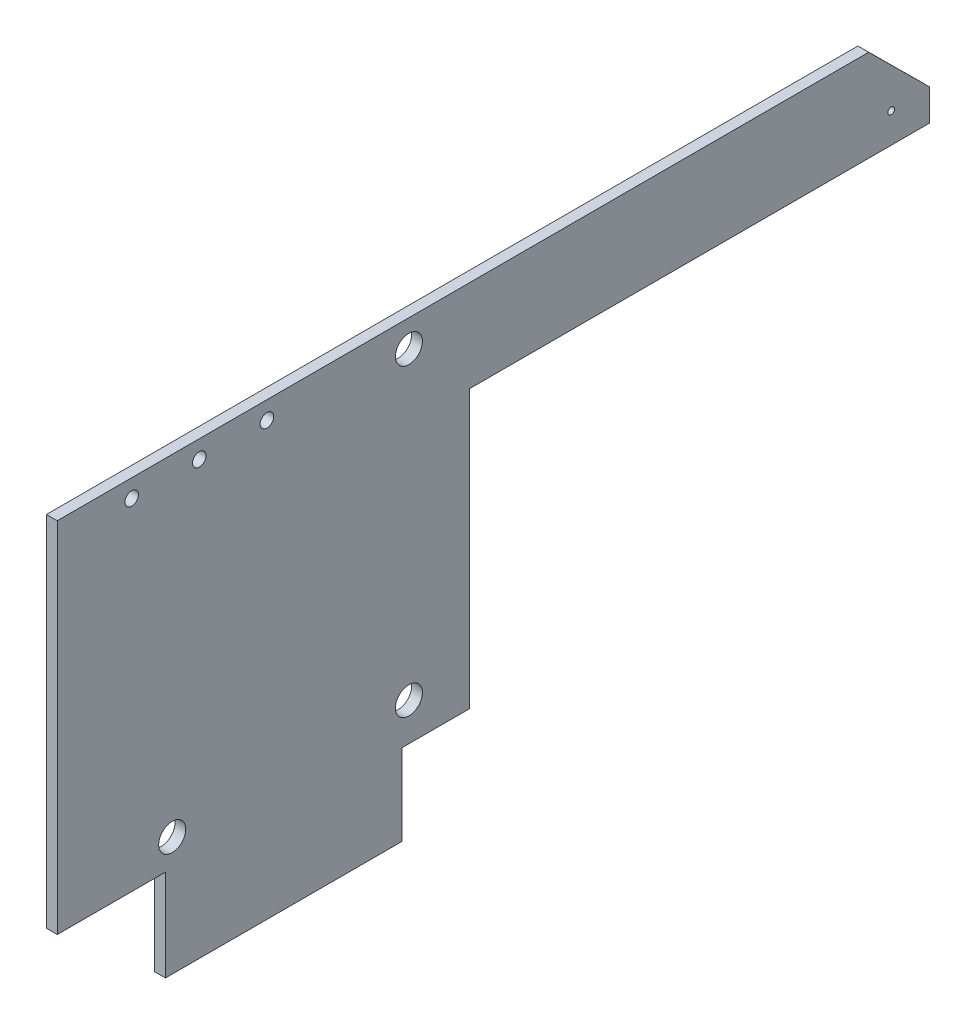
ISO-10303-21;
HEADER;
FILE_DESCRIPTION(('STEP AP214'),'2;1');
FILE_NAME('part.step','',(''),(''),'','','');
FILE_SCHEMA(('AUTOMOTIVE_DESIGN { 1 0 10303 214 1 1 1 1 }'));
ENDSEC;
DATA;
#1=APPLICATION_CONTEXT('core data for automotive mechanical design processes');
#2=APPLICATION_PROTOCOL_DEFINITION('international standard','automotive_design',2000,#1);
#3=PRODUCT_CONTEXT('',#1,'mechanical');
#4=PRODUCT('Part','Part','',(#3));
#5=PRODUCT_RELATED_PRODUCT_CATEGORY('part','',(#4));
#6=PRODUCT_DEFINITION_FORMATION('','',#4);
#7=PRODUCT_DEFINITION_CONTEXT('part definition',#1,'design');
#8=PRODUCT_DEFINITION('design','',#6,#7);
#9=PRODUCT_DEFINITION_SHAPE('','',#8);
#10=(LENGTH_UNIT() NAMED_UNIT(*) SI_UNIT(.MILLI.,.METRE.));
#11=(NAMED_UNIT(*) PLANE_ANGLE_UNIT() SI_UNIT($,.RADIAN.));
#12=(NAMED_UNIT(*) SI_UNIT($,.STERADIAN.) SOLID_ANGLE_UNIT());
#13=UNCERTAINTY_MEASURE_WITH_UNIT(LENGTH_MEASURE(1.E-05),#10,'distance_accuracy_value','');
#14=(GEOMETRIC_REPRESENTATION_CONTEXT(3) GLOBAL_UNCERTAINTY_ASSIGNED_CONTEXT((#13)) GLOBAL_UNIT_ASSIGNED_CONTEXT((#10,
#11,#12)) REPRESENTATION_CONTEXT('',''));
#15=CARTESIAN_POINT('',(0.,0.,0.));
#16=DIRECTION('',(0.,0.,1.));
#17=DIRECTION('',(1.,0.,0.));
#18=AXIS2_PLACEMENT_3D('',#15,#16,#17);
#19=CARTESIAN_POINT('',(1.6,0.,0.));
#20=DIRECTION('',(-1.,0.,0.));
#21=DIRECTION('',(0.,0.,1.));
#22=AXIS2_PLACEMENT_3D('',#19,#20,#21);
#23=PLANE('',#22);
#24=DIRECTION('',(0.,0.,-1.));
#25=VECTOR('',#24,1.);
#26=CARTESIAN_POINT('',(1.6,11.,-19.));
#27=LINE('',#26,#25);
#28=CARTESIAN_POINT('',(1.6,11.,-3.));
#29=VERTEX_POINT('',#28);
#30=CARTESIAN_POINT('',(1.6,11.,-19.));
#31=VERTEX_POINT('',#30);
#32=EDGE_CURVE('E169',#29,#31,#27,.T.);
#33=ORIENTED_EDGE('',*,*,#32,.T.);
#34=DIRECTION('',(0.,-1.,0.));
#35=VECTOR('',#34,1.);
#36=CARTESIAN_POINT('',(1.6,-2.56392602125544,-19.));
#37=LINE('',#36,#35);
#38=CARTESIAN_POINT('',(1.6,-2.56392602125544,-19.));
#39=VERTEX_POINT('',#38);
#40=EDGE_CURVE('E102',#31,#39,#37,.T.);
#41=ORIENTED_EDGE('',*,*,#40,.T.);
#42=DIRECTION('',(0.,0.,-1.));
#43=VECTOR('',#42,1.);
#44=CARTESIAN_POINT('',(1.6,-2.56392602125544,-54.));
#45=LINE('',#44,#43);
#46=CARTESIAN_POINT('',(1.6,-2.56392602125544,-54.));
#47=VERTEX_POINT('',#46);
#48=EDGE_CURVE('E193',#39,#47,#45,.T.);
#49=ORIENTED_EDGE('',*,*,#48,.T.);
#50=DIRECTION('',(0.,1.,0.));
#51=VECTOR('',#50,1.);
#52=CARTESIAN_POINT('',(1.6,9.43607397874456,-54.));
#53=LINE('',#52,#51);
#54=CARTESIAN_POINT('',(1.6,9.43607397874456,-54.));
#55=VERTEX_POINT('',#54);
#56=EDGE_CURVE('E212',#47,#55,#53,.T.);
#57=ORIENTED_EDGE('',*,*,#56,.T.);
#58=DIRECTION('',(0.,0.,-1.));
#59=VECTOR('',#58,1.);
#60=CARTESIAN_POINT('',(1.6,9.43607397874456,-64.));
#61=LINE('',#60,#59);
#62=CARTESIAN_POINT('',(1.6,9.43607397874456,-64.));
#63=VERTEX_POINT('',#62);
#64=EDGE_CURVE('E209',#55,#63,#61,.T.);
#65=ORIENTED_EDGE('',*,*,#64,.T.);
#66=DIRECTION('',(0.,1.,0.));
#67=VECTOR('',#66,1.);
#68=CARTESIAN_POINT('',(1.6,50.4234303047777,-64.));
#69=LINE('',#68,#67);
#70=CARTESIAN_POINT('',(1.6,50.4234303047777,-64.));
#71=VERTEX_POINT('',#70);
#72=EDGE_CURVE('E211',#63,#71,#69,.T.);
#73=ORIENTED_EDGE('',*,*,#72,.T.);
#74=DIRECTION('',(0.,0.,-1.));
#75=VECTOR('',#74,1.);
#76=CARTESIAN_POINT('',(1.6,50.4234303047777,-132.));
#77=LINE('',#76,#75);
#78=CARTESIAN_POINT('',(1.6,50.4234303047777,-132.));
#79=VERTEX_POINT('',#78);
#80=EDGE_CURVE('E214',#71,#79,#77,.T.);
#81=ORIENTED_EDGE('',*,*,#80,.T.);
#82=DIRECTION('',(0.,1.,0.));
#83=VECTOR('',#82,1.);
#84=CARTESIAN_POINT('',(1.6,55.0634303047775,-132.));
#85=LINE('',#84,#83);
#86=CARTESIAN_POINT('',(1.6,55.0634303047775,-132.));
#87=VERTEX_POINT('',#86);
#88=EDGE_CURVE('E130',#79,#87,#85,.T.);
#89=ORIENTED_EDGE('',*,*,#88,.T.);
#90=DIRECTION('',(0.,0.70460178581762,0.709602933634452));
#91=VECTOR('',#90,1.);
#92=CARTESIAN_POINT('',(1.6,64.,-123.));
#93=LINE('',#92,#91);
#94=CARTESIAN_POINT('',(1.6,64.,-123.));
#95=VERTEX_POINT('',#94);
#96=EDGE_CURVE('E124',#87,#95,#93,.T.);
#97=ORIENTED_EDGE('',*,*,#96,.T.);
#98=DIRECTION('',(0.,0.,1.));
#99=VECTOR('',#98,1.);
#100=CARTESIAN_POINT('',(1.6,64.,-3.));
#101=LINE('',#100,#99);
#102=CARTESIAN_POINT('',(1.6,64.,-3.));
#103=VERTEX_POINT('',#102);
#104=EDGE_CURVE('E128',#95,#103,#101,.T.);
#105=ORIENTED_EDGE('',*,*,#104,.T.);
#106=DIRECTION('',(0.,-1.,0.));
#107=VECTOR('',#106,1.);
#108=CARTESIAN_POINT('',(1.6,11.,-3.));
#109=LINE('',#108,#107);
#110=EDGE_CURVE('E50',#103,#29,#109,.T.);
#111=ORIENTED_EDGE('',*,*,#110,.T.);
#112=EDGE_LOOP('',(#33,#41,#49,#57,#65,#73,#81,#89,#97,#105,#111));
#113=FACE_BOUND('',#112,.T.);
#114=CARTESIAN_POINT('',(1.6,15.,-20.));
#115=DIRECTION('',(1.,0.,0.));
#116=DIRECTION('',(0.,0.,-1.));
#117=AXIS2_PLACEMENT_3D('',#114,#115,#116);
#118=CIRCLE('',#117,2.);
#119=CARTESIAN_POINT('',(1.6,15.,-22.));
#120=VERTEX_POINT('',#119);
#121=EDGE_CURVE('E152',#120,#120,#118,.T.);
#122=ORIENTED_EDGE('',*,*,#121,.F.);
#123=EDGE_LOOP('',(#122));
#124=FACE_BOUND('',#123,.T.);
#125=CARTESIAN_POINT('',(1.6,15.,-55.));
#126=DIRECTION('',(1.,0.,0.));
#127=DIRECTION('',(0.,0.,-1.));
#128=AXIS2_PLACEMENT_3D('',#125,#126,#127);
#129=CIRCLE('',#128,2.);
#130=CARTESIAN_POINT('',(1.6,15.,-57.));
#131=VERTEX_POINT('',#130);
#132=EDGE_CURVE('E311',#131,#131,#129,.T.);
#133=ORIENTED_EDGE('',*,*,#132,.F.);
#134=EDGE_LOOP('',(#133));
#135=FACE_BOUND('',#134,.T.);
#136=CARTESIAN_POINT('',(1.6,60.,-55.));
#137=DIRECTION('',(1.,0.,0.));
#138=DIRECTION('',(0.,0.,-1.));
#139=AXIS2_PLACEMENT_3D('',#136,#137,#138);
#140=CIRCLE('',#139,2.);
#141=CARTESIAN_POINT('',(1.6,60.,-57.));
#142=VERTEX_POINT('',#141);
#143=EDGE_CURVE('E305',#142,#142,#140,.T.);
#144=ORIENTED_EDGE('',*,*,#143,.F.);
#145=EDGE_LOOP('',(#144));
#146=FACE_BOUND('',#145,.T.);
#147=CARTESIAN_POINT('',(1.6,61.35,-24.));
#148=DIRECTION('',(1.,0.,0.));
#149=DIRECTION('',(0.,0.,-1.));
#150=AXIS2_PLACEMENT_3D('',#147,#148,#149);
#151=CIRCLE('',#150,1.00000000000001);
#152=CARTESIAN_POINT('',(1.6,61.35,-25.));
#153=VERTEX_POINT('',#152);
#154=EDGE_CURVE('E299',#153,#153,#151,.T.);
#155=ORIENTED_EDGE('',*,*,#154,.F.);
#156=EDGE_LOOP('',(#155));
#157=FACE_BOUND('',#156,.T.);
#158=CARTESIAN_POINT('',(1.6,61.35,-34.));
#159=DIRECTION('',(1.,0.,0.));
#160=DIRECTION('',(0.,0.,-1.));
#161=AXIS2_PLACEMENT_3D('',#158,#159,#160);
#162=CIRCLE('',#161,0.999999999999998);
#163=CARTESIAN_POINT('',(1.6,61.35,-35.));
#164=VERTEX_POINT('',#163);
#165=EDGE_CURVE('E293',#164,#164,#162,.T.);
#166=ORIENTED_EDGE('',*,*,#165,.F.);
#167=EDGE_LOOP('',(#166));
#168=FACE_BOUND('',#167,.T.);
#169=CARTESIAN_POINT('',(1.6,61.35,-14.));
#170=DIRECTION('',(1.,0.,0.));
#171=DIRECTION('',(0.,0.,-1.));
#172=AXIS2_PLACEMENT_3D('',#169,#170,#171);
#173=CIRCLE('',#172,1.00000000000001);
#174=CARTESIAN_POINT('',(1.6,61.35,-15.));
#175=VERTEX_POINT('',#174);
#176=EDGE_CURVE('E287',#175,#175,#173,.T.);
#177=ORIENTED_EDGE('',*,*,#176,.F.);
#178=EDGE_LOOP('',(#177));
#179=FACE_BOUND('',#178,.T.);
#180=CARTESIAN_POINT('',(1.6,54.8322024098017,-126.328248557873));
#181=DIRECTION('',(1.,0.,0.));
#182=DIRECTION('',(0.,0.,-1.));
#183=AXIS2_PLACEMENT_3D('',#180,#181,#182);
#184=CIRCLE('',#183,0.499999999999999);
#185=CARTESIAN_POINT('',(1.6,54.8322024098017,-126.828248557873));
#186=VERTEX_POINT('',#185);
#187=EDGE_CURVE('E278',#186,#186,#184,.T.);
#188=ORIENTED_EDGE('',*,*,#187,.F.);
#189=EDGE_LOOP('',(#188));
#190=FACE_BOUND('',#189,.T.);
#191=ADVANCED_FACE('F33',(#113,#124,#135,#146,#157,#168,#179,#190),#23,.F.);
#192=CARTESIAN_POINT('',(0.,0.,0.));
#193=DIRECTION('',(-1.,0.,0.));
#194=DIRECTION('',(0.,0.,1.));
#195=AXIS2_PLACEMENT_3D('',#192,#193,#194);
#196=PLANE('',#195);
#197=CARTESIAN_POINT('',(0.,61.35,-14.));
#198=DIRECTION('',(1.,0.,0.));
#199=DIRECTION('',(0.,0.,-1.));
#200=AXIS2_PLACEMENT_3D('',#197,#198,#199);
#201=CIRCLE('',#200,1.00000000000001);
#202=CARTESIAN_POINT('',(0.,61.35,-15.));
#203=VERTEX_POINT('',#202);
#204=EDGE_CURVE('E284',#203,#203,#201,.T.);
#205=ORIENTED_EDGE('',*,*,#204,.T.);
#206=EDGE_LOOP('',(#205));
#207=FACE_BOUND('',#206,.T.);
#208=CARTESIAN_POINT('',(0.,61.35,-24.));
#209=DIRECTION('',(1.,0.,0.));
#210=DIRECTION('',(0.,0.,-1.));
#211=AXIS2_PLACEMENT_3D('',#208,#209,#210);
#212=CIRCLE('',#211,1.00000000000001);
#213=CARTESIAN_POINT('',(0.,61.35,-25.));
#214=VERTEX_POINT('',#213);
#215=EDGE_CURVE('E296',#214,#214,#212,.T.);
#216=ORIENTED_EDGE('',*,*,#215,.T.);
#217=EDGE_LOOP('',(#216));
#218=FACE_BOUND('',#217,.T.);
#219=CARTESIAN_POINT('',(0.,15.,-55.));
#220=DIRECTION('',(1.,0.,0.));
#221=DIRECTION('',(0.,0.,-1.));
#222=AXIS2_PLACEMENT_3D('',#219,#220,#221);
#223=CIRCLE('',#222,2.);
#224=CARTESIAN_POINT('',(0.,15.,-57.));
#225=VERTEX_POINT('',#224);
#226=EDGE_CURVE('E308',#225,#225,#223,.T.);
#227=ORIENTED_EDGE('',*,*,#226,.T.);
#228=EDGE_LOOP('',(#227));
#229=FACE_BOUND('',#228,.T.);
#230=DIRECTION('',(0.,0.,-1.));
#231=VECTOR('',#230,1.);
#232=CARTESIAN_POINT('',(0.,11.,-19.));
#233=LINE('',#232,#231);
#234=CARTESIAN_POINT('',(0.,11.,-3.));
#235=VERTEX_POINT('',#234);
#236=CARTESIAN_POINT('',(0.,11.,-19.));
#237=VERTEX_POINT('',#236);
#238=EDGE_CURVE('E148',#235,#237,#233,.T.);
#239=ORIENTED_EDGE('',*,*,#238,.F.);
#240=DIRECTION('',(0.,-1.,0.));
#241=VECTOR('',#240,1.);
#242=CARTESIAN_POINT('',(0.,11.,-3.));
#243=LINE('',#242,#241);
#244=CARTESIAN_POINT('',(0.,64.,-3.));
#245=VERTEX_POINT('',#244);
#246=EDGE_CURVE('E94',#245,#235,#243,.T.);
#247=ORIENTED_EDGE('',*,*,#246,.F.);
#248=DIRECTION('',(0.,0.,1.));
#249=VECTOR('',#248,1.);
#250=CARTESIAN_POINT('',(0.,64.,-3.));
#251=LINE('',#250,#249);
#252=CARTESIAN_POINT('',(0.,64.,-123.));
#253=VERTEX_POINT('',#252);
#254=EDGE_CURVE('E88',#253,#245,#251,.T.);
#255=ORIENTED_EDGE('',*,*,#254,.F.);
#256=DIRECTION('',(0.,0.70460178581762,0.709602933634452));
#257=VECTOR('',#256,1.);
#258=CARTESIAN_POINT('',(0.,64.,-123.));
#259=LINE('',#258,#257);
#260=CARTESIAN_POINT('',(0.,55.0634303047775,-132.));
#261=VERTEX_POINT('',#260);
#262=EDGE_CURVE('E138',#261,#253,#259,.T.);
#263=ORIENTED_EDGE('',*,*,#262,.F.);
#264=DIRECTION('',(0.,1.,0.));
#265=VECTOR('',#264,1.);
#266=CARTESIAN_POINT('',(0.,55.0634303047775,-132.));
#267=LINE('',#266,#265);
#268=CARTESIAN_POINT('',(0.,50.4234303047777,-132.));
#269=VERTEX_POINT('',#268);
#270=EDGE_CURVE('E164',#269,#261,#267,.T.);
#271=ORIENTED_EDGE('',*,*,#270,.F.);
#272=DIRECTION('',(0.,0.,-1.));
#273=VECTOR('',#272,1.);
#274=CARTESIAN_POINT('',(0.,50.4234303047777,-132.));
#275=LINE('',#274,#273);
#276=CARTESIAN_POINT('',(0.,50.4234303047777,-64.));
#277=VERTEX_POINT('',#276);
#278=EDGE_CURVE('E162',#277,#269,#275,.T.);
#279=ORIENTED_EDGE('',*,*,#278,.F.);
#280=DIRECTION('',(0.,1.,0.));
#281=VECTOR('',#280,1.);
#282=CARTESIAN_POINT('',(0.,50.4234303047777,-64.));
#283=LINE('',#282,#281);
#284=CARTESIAN_POINT('',(0.,9.43607397874456,-64.));
#285=VERTEX_POINT('',#284);
#286=EDGE_CURVE('E160',#285,#277,#283,.T.);
#287=ORIENTED_EDGE('',*,*,#286,.F.);
#288=DIRECTION('',(0.,0.,-1.));
#289=VECTOR('',#288,1.);
#290=CARTESIAN_POINT('',(0.,9.43607397874456,-64.));
#291=LINE('',#290,#289);
#292=CARTESIAN_POINT('',(0.,9.43607397874456,-54.));
#293=VERTEX_POINT('',#292);
#294=EDGE_CURVE('E158',#293,#285,#291,.T.);
#295=ORIENTED_EDGE('',*,*,#294,.F.);
#296=DIRECTION('',(0.,1.,0.));
#297=VECTOR('',#296,1.);
#298=CARTESIAN_POINT('',(0.,9.43607397874456,-54.));
#299=LINE('',#298,#297);
#300=CARTESIAN_POINT('',(0.,-2.56392602125544,-54.));
#301=VERTEX_POINT('',#300);
#302=EDGE_CURVE('E156',#301,#293,#299,.T.);
#303=ORIENTED_EDGE('',*,*,#302,.F.);
#304=DIRECTION('',(0.,0.,-1.));
#305=VECTOR('',#304,1.);
#306=CARTESIAN_POINT('',(0.,-2.56392602125544,-54.));
#307=LINE('',#306,#305);
#308=CARTESIAN_POINT('',(0.,-2.56392602125544,-19.));
#309=VERTEX_POINT('',#308);
#310=EDGE_CURVE('E154',#309,#301,#307,.T.);
#311=ORIENTED_EDGE('',*,*,#310,.F.);
#312=DIRECTION('',(0.,-1.,0.));
#313=VECTOR('',#312,1.);
#314=CARTESIAN_POINT('',(0.,-2.56392602125544,-19.));
#315=LINE('',#314,#313);
#316=EDGE_CURVE('E151',#237,#309,#315,.T.);
#317=ORIENTED_EDGE('',*,*,#316,.F.);
#318=EDGE_LOOP('',(#239,#247,#255,#263,#271,#279,#287,#295,#303,#311,#317));
#319=FACE_BOUND('',#318,.T.);
#320=CARTESIAN_POINT('',(0.,15.,-20.));
#321=DIRECTION('',(1.,0.,0.));
#322=DIRECTION('',(0.,0.,-1.));
#323=AXIS2_PLACEMENT_3D('',#320,#321,#322);
#324=CIRCLE('',#323,2.);
#325=CARTESIAN_POINT('',(0.,15.,-22.));
#326=VERTEX_POINT('',#325);
#327=EDGE_CURVE('E314',#326,#326,#324,.T.);
#328=ORIENTED_EDGE('',*,*,#327,.T.);
#329=EDGE_LOOP('',(#328));
#330=FACE_BOUND('',#329,.T.);
#331=CARTESIAN_POINT('',(0.,60.,-55.));
#332=DIRECTION('',(1.,0.,0.));
#333=DIRECTION('',(0.,0.,-1.));
#334=AXIS2_PLACEMENT_3D('',#331,#332,#333);
#335=CIRCLE('',#334,2.);
#336=CARTESIAN_POINT('',(0.,60.,-57.));
#337=VERTEX_POINT('',#336);
#338=EDGE_CURVE('E302',#337,#337,#335,.T.);
#339=ORIENTED_EDGE('',*,*,#338,.T.);
#340=EDGE_LOOP('',(#339));
#341=FACE_BOUND('',#340,.T.);
#342=CARTESIAN_POINT('',(0.,61.35,-34.));
#343=DIRECTION('',(1.,0.,0.));
#344=DIRECTION('',(0.,0.,-1.));
#345=AXIS2_PLACEMENT_3D('',#342,#343,#344);
#346=CIRCLE('',#345,0.999999999999998);
#347=CARTESIAN_POINT('',(0.,61.35,-35.));
#348=VERTEX_POINT('',#347);
#349=EDGE_CURVE('E290',#348,#348,#346,.T.);
#350=ORIENTED_EDGE('',*,*,#349,.T.);
#351=EDGE_LOOP('',(#350));
#352=FACE_BOUND('',#351,.T.);
#353=CARTESIAN_POINT('',(0.,54.8322024098017,-126.328248557873));
#354=DIRECTION('',(1.,0.,0.));
#355=DIRECTION('',(0.,0.,-1.));
#356=AXIS2_PLACEMENT_3D('',#353,#354,#355);
#357=CIRCLE('',#356,0.499999999999999);
#358=CARTESIAN_POINT('',(0.,54.8322024098017,-126.828248557873));
#359=VERTEX_POINT('',#358);
#360=EDGE_CURVE('E281',#359,#359,#357,.T.);
#361=ORIENTED_EDGE('',*,*,#360,.T.);
#362=EDGE_LOOP('',(#361));
#363=FACE_BOUND('',#362,.T.);
#364=ADVANCED_FACE('F197',(#207,#218,#229,#319,#330,#341,#352,#363),#196,.T.);
#365=CARTESIAN_POINT('',(1.6,11.,-19.));
#366=DIRECTION('',(0.,1.,0.));
#367=DIRECTION('',(0.,0.,1.));
#368=AXIS2_PLACEMENT_3D('',#365,#366,#367);
#369=PLANE('',#368);
#370=ORIENTED_EDGE('',*,*,#238,.T.);
#371=DIRECTION('',(-1.,0.,0.));
#372=VECTOR('',#371,1.);
#373=CARTESIAN_POINT('',(1.6,11.,-19.));
#374=LINE('',#373,#372);
#375=EDGE_CURVE('E11',#31,#237,#374,.T.);
#376=ORIENTED_EDGE('',*,*,#375,.F.);
#377=ORIENTED_EDGE('',*,*,#32,.F.);
#378=DIRECTION('',(-1.,0.,0.));
#379=VECTOR('',#378,1.);
#380=CARTESIAN_POINT('',(1.6,11.,-3.));
#381=LINE('',#380,#379);
#382=EDGE_CURVE('E144',#29,#235,#381,.T.);
#383=ORIENTED_EDGE('',*,*,#382,.T.);
#384=EDGE_LOOP('',(#370,#376,#377,#383));
#385=FACE_BOUND('',#384,.T.);
#386=ADVANCED_FACE('F35',(#385),#369,.F.);
#387=CARTESIAN_POINT('',(1.6,-2.56392602125544,-19.));
#388=DIRECTION('',(0.,0.,-1.));
#389=DIRECTION('',(-1.,0.,0.));
#390=AXIS2_PLACEMENT_3D('',#387,#388,#389);
#391=PLANE('',#390);
#392=ORIENTED_EDGE('',*,*,#316,.T.);
#393=DIRECTION('',(-1.,0.,0.));
#394=VECTOR('',#393,1.);
#395=CARTESIAN_POINT('',(1.6,-2.56392602125544,-19.));
#396=LINE('',#395,#394);
#397=EDGE_CURVE('E42',#39,#309,#396,.T.);
#398=ORIENTED_EDGE('',*,*,#397,.F.);
#399=ORIENTED_EDGE('',*,*,#40,.F.);
#400=ORIENTED_EDGE('',*,*,#375,.T.);
#401=EDGE_LOOP('',(#392,#398,#399,#400));
#402=FACE_BOUND('',#401,.T.);
#403=ADVANCED_FACE('F443',(#402),#391,.F.);
#404=CARTESIAN_POINT('',(1.6,-2.56392602125544,-54.));
#405=DIRECTION('',(0.,1.,0.));
#406=DIRECTION('',(0.,0.,1.));
#407=AXIS2_PLACEMENT_3D('',#404,#405,#406);
#408=PLANE('',#407);
#409=ORIENTED_EDGE('',*,*,#310,.T.);
#410=DIRECTION('',(-1.,0.,0.));
#411=VECTOR('',#410,1.);
#412=CARTESIAN_POINT('',(1.6,-2.56392602125544,-54.));
#413=LINE('',#412,#411);
#414=EDGE_CURVE('E185',#47,#301,#413,.T.);
#415=ORIENTED_EDGE('',*,*,#414,.F.);
#416=ORIENTED_EDGE('',*,*,#48,.F.);
#417=ORIENTED_EDGE('',*,*,#397,.T.);
#418=EDGE_LOOP('',(#409,#415,#416,#417));
#419=FACE_BOUND('',#418,.T.);
#420=ADVANCED_FACE('F191',(#419),#408,.F.);
#421=CARTESIAN_POINT('',(1.6,9.43607397874456,-54.));
#422=DIRECTION('',(0.,0.,1.));
#423=DIRECTION('',(1.,0.,0.));
#424=AXIS2_PLACEMENT_3D('',#421,#422,#423);
#425=PLANE('',#424);
#426=ORIENTED_EDGE('',*,*,#302,.T.);
#427=DIRECTION('',(-1.,0.,0.));
#428=VECTOR('',#427,1.);
#429=CARTESIAN_POINT('',(1.6,9.43607397874456,-54.));
#430=LINE('',#429,#428);
#431=EDGE_CURVE('E182',#55,#293,#430,.T.);
#432=ORIENTED_EDGE('',*,*,#431,.F.);
#433=ORIENTED_EDGE('',*,*,#56,.F.);
#434=ORIENTED_EDGE('',*,*,#414,.T.);
#435=EDGE_LOOP('',(#426,#432,#433,#434));
#436=FACE_BOUND('',#435,.T.);
#437=ADVANCED_FACE('F203',(#436),#425,.F.);
#438=CARTESIAN_POINT('',(1.6,9.43607397874456,-64.));
#439=DIRECTION('',(0.,1.,0.));
#440=DIRECTION('',(0.,0.,1.));
#441=AXIS2_PLACEMENT_3D('',#438,#439,#440);
#442=PLANE('',#441);
#443=ORIENTED_EDGE('',*,*,#294,.T.);
#444=DIRECTION('',(-1.,0.,0.));
#445=VECTOR('',#444,1.);
#446=CARTESIAN_POINT('',(1.6,9.43607397874456,-64.));
#447=LINE('',#446,#445);
#448=EDGE_CURVE('E179',#63,#285,#447,.T.);
#449=ORIENTED_EDGE('',*,*,#448,.F.);
#450=ORIENTED_EDGE('',*,*,#64,.F.);
#451=ORIENTED_EDGE('',*,*,#431,.T.);
#452=EDGE_LOOP('',(#443,#449,#450,#451));
#453=FACE_BOUND('',#452,.T.);
#454=ADVANCED_FACE('F207',(#453),#442,.F.);
#455=CARTESIAN_POINT('',(1.6,50.4234303047777,-64.));
#456=DIRECTION('',(0.,0.,1.));
#457=DIRECTION('',(0.,-1.,0.));
#458=AXIS2_PLACEMENT_3D('',#455,#456,#457);
#459=PLANE('',#458);
#460=ORIENTED_EDGE('',*,*,#286,.T.);
#461=DIRECTION('',(-1.,0.,0.));
#462=VECTOR('',#461,1.);
#463=CARTESIAN_POINT('',(1.6,50.4234303047777,-64.));
#464=LINE('',#463,#462);
#465=EDGE_CURVE('E176',#71,#277,#464,.T.);
#466=ORIENTED_EDGE('',*,*,#465,.F.);
#467=ORIENTED_EDGE('',*,*,#72,.F.);
#468=ORIENTED_EDGE('',*,*,#448,.T.);
#469=EDGE_LOOP('',(#460,#466,#467,#468));
#470=FACE_BOUND('',#469,.T.);
#471=ADVANCED_FACE('F409',(#470),#459,.F.);
#472=CARTESIAN_POINT('',(1.6,50.4234303047777,-132.));
#473=DIRECTION('',(0.,1.,0.));
#474=DIRECTION('',(0.,0.,1.));
#475=AXIS2_PLACEMENT_3D('',#472,#473,#474);
#476=PLANE('',#475);
#477=ORIENTED_EDGE('',*,*,#278,.T.);
#478=DIRECTION('',(-1.,0.,0.));
#479=VECTOR('',#478,1.);
#480=CARTESIAN_POINT('',(1.6,50.4234303047777,-132.));
#481=LINE('',#480,#479);
#482=EDGE_CURVE('E173',#79,#269,#481,.T.);
#483=ORIENTED_EDGE('',*,*,#482,.F.);
#484=ORIENTED_EDGE('',*,*,#80,.F.);
#485=ORIENTED_EDGE('',*,*,#465,.T.);
#486=EDGE_LOOP('',(#477,#483,#484,#485));
#487=FACE_BOUND('',#486,.T.);
#488=ADVANCED_FACE('F223',(#487),#476,.F.);
#489=CARTESIAN_POINT('',(1.6,55.0634303047775,-132.));
#490=DIRECTION('',(0.,0.,1.));
#491=DIRECTION('',(1.,0.,0.));
#492=AXIS2_PLACEMENT_3D('',#489,#490,#491);
#493=PLANE('',#492);
#494=ORIENTED_EDGE('',*,*,#270,.T.);
#495=DIRECTION('',(-1.,0.,0.));
#496=VECTOR('',#495,1.);
#497=CARTESIAN_POINT('',(1.6,55.0634303047775,-132.));
#498=LINE('',#497,#496);
#499=EDGE_CURVE('E139',#87,#261,#498,.T.);
#500=ORIENTED_EDGE('',*,*,#499,.F.);
#501=ORIENTED_EDGE('',*,*,#88,.F.);
#502=ORIENTED_EDGE('',*,*,#482,.T.);
#503=EDGE_LOOP('',(#494,#500,#501,#502));
#504=FACE_BOUND('',#503,.T.);
#505=ADVANCED_FACE('F227',(#504),#493,.F.);
#506=CARTESIAN_POINT('',(1.6,64.,-123.));
#507=DIRECTION('',(0.,-0.709602933634452,0.70460178581762));
#508=DIRECTION('',(0.,-0.70460178581762,-0.709602933634452));
#509=AXIS2_PLACEMENT_3D('',#506,#507,#508);
#510=PLANE('',#509);
#511=ORIENTED_EDGE('',*,*,#262,.T.);
#512=DIRECTION('',(-1.,0.,0.));
#513=VECTOR('',#512,1.);
#514=CARTESIAN_POINT('',(1.6,64.,-123.));
#515=LINE('',#514,#513);
#516=EDGE_CURVE('E135',#95,#253,#515,.T.);
#517=ORIENTED_EDGE('',*,*,#516,.F.);
#518=ORIENTED_EDGE('',*,*,#96,.F.);
#519=ORIENTED_EDGE('',*,*,#499,.T.);
#520=EDGE_LOOP('',(#511,#517,#518,#519));
#521=FACE_BOUND('',#520,.T.);
#522=ADVANCED_FACE('F136',(#521),#510,.F.);
#523=CARTESIAN_POINT('',(1.6,64.,-3.));
#524=DIRECTION('',(0.,-1.,0.));
#525=DIRECTION('',(0.,0.,-1.));
#526=AXIS2_PLACEMENT_3D('',#523,#524,#525);
#527=PLANE('',#526);
#528=ORIENTED_EDGE('',*,*,#254,.T.);
#529=DIRECTION('',(-1.,0.,0.));
#530=VECTOR('',#529,1.);
#531=CARTESIAN_POINT('',(1.6,64.,-3.));
#532=LINE('',#531,#530);
#533=EDGE_CURVE('E140',#103,#245,#532,.T.);
#534=ORIENTED_EDGE('',*,*,#533,.F.);
#535=ORIENTED_EDGE('',*,*,#104,.F.);
#536=ORIENTED_EDGE('',*,*,#516,.T.);
#537=EDGE_LOOP('',(#528,#534,#535,#536));
#538=FACE_BOUND('',#537,.T.);
#539=ADVANCED_FACE('F142',(#538),#527,.F.);
#540=CARTESIAN_POINT('',(1.6,11.,-3.));
#541=DIRECTION('',(0.,0.,-1.));
#542=DIRECTION('',(0.,1.,0.));
#543=AXIS2_PLACEMENT_3D('',#540,#541,#542);
#544=PLANE('',#543);
#545=ORIENTED_EDGE('',*,*,#246,.T.);
#546=ORIENTED_EDGE('',*,*,#382,.F.);
#547=ORIENTED_EDGE('',*,*,#110,.F.);
#548=ORIENTED_EDGE('',*,*,#533,.T.);
#549=EDGE_LOOP('',(#545,#546,#547,#548));
#550=FACE_BOUND('',#549,.T.);
#551=ADVANCED_FACE('F231',(#550),#544,.F.);
#552=CARTESIAN_POINT('',(1.6,15.,-20.));
#553=DIRECTION('',(-1.,0.,0.));
#554=DIRECTION('',(0.,0.,1.));
#555=AXIS2_PLACEMENT_3D('',#552,#553,#554);
#556=CYLINDRICAL_SURFACE('',#555,2.);
#557=ORIENTED_EDGE('',*,*,#121,.T.);
#558=EDGE_LOOP('',(#557));
#559=FACE_BOUND('',#558,.T.);
#560=ORIENTED_EDGE('',*,*,#327,.F.);
#561=EDGE_LOOP('',(#560));
#562=FACE_BOUND('',#561,.T.);
#563=ADVANCED_FACE('F233',(#559,#562),#556,.F.);
#564=CARTESIAN_POINT('',(1.6,15.,-55.));
#565=DIRECTION('',(-1.,0.,0.));
#566=DIRECTION('',(0.,0.,1.));
#567=AXIS2_PLACEMENT_3D('',#564,#565,#566);
#568=CYLINDRICAL_SURFACE('',#567,2.);
#569=ORIENTED_EDGE('',*,*,#132,.T.);
#570=EDGE_LOOP('',(#569));
#571=FACE_BOUND('',#570,.T.);
#572=ORIENTED_EDGE('',*,*,#226,.F.);
#573=EDGE_LOOP('',(#572));
#574=FACE_BOUND('',#573,.T.);
#575=ADVANCED_FACE('F239',(#571,#574),#568,.F.);
#576=CARTESIAN_POINT('',(1.6,60.,-55.));
#577=DIRECTION('',(-1.,0.,0.));
#578=DIRECTION('',(0.,0.,1.));
#579=AXIS2_PLACEMENT_3D('',#576,#577,#578);
#580=CYLINDRICAL_SURFACE('',#579,2.);
#581=ORIENTED_EDGE('',*,*,#143,.T.);
#582=EDGE_LOOP('',(#581));
#583=FACE_BOUND('',#582,.T.);
#584=ORIENTED_EDGE('',*,*,#338,.F.);
#585=EDGE_LOOP('',(#584));
#586=FACE_BOUND('',#585,.T.);
#587=ADVANCED_FACE('F253',(#583,#586),#580,.F.);
#588=CARTESIAN_POINT('',(1.6,61.35,-24.));
#589=DIRECTION('',(-1.,0.,0.));
#590=DIRECTION('',(0.,0.,1.));
#591=AXIS2_PLACEMENT_3D('',#588,#589,#590);
#592=CYLINDRICAL_SURFACE('',#591,1.00000000000001);
#593=ORIENTED_EDGE('',*,*,#154,.T.);
#594=EDGE_LOOP('',(#593));
#595=FACE_BOUND('',#594,.T.);
#596=ORIENTED_EDGE('',*,*,#215,.F.);
#597=EDGE_LOOP('',(#596));
#598=FACE_BOUND('',#597,.T.);
#599=ADVANCED_FACE('F257',(#595,#598),#592,.F.);
#600=CARTESIAN_POINT('',(1.6,61.35,-34.));
#601=DIRECTION('',(-1.,0.,0.));
#602=DIRECTION('',(0.,0.,1.));
#603=AXIS2_PLACEMENT_3D('',#600,#601,#602);
#604=CYLINDRICAL_SURFACE('',#603,0.999999999999998);
#605=ORIENTED_EDGE('',*,*,#165,.T.);
#606=EDGE_LOOP('',(#605));
#607=FACE_BOUND('',#606,.T.);
#608=ORIENTED_EDGE('',*,*,#349,.F.);
#609=EDGE_LOOP('',(#608));
#610=FACE_BOUND('',#609,.T.);
#611=ADVANCED_FACE('F261',(#607,#610),#604,.F.);
#612=CARTESIAN_POINT('',(1.6,61.35,-14.));
#613=DIRECTION('',(-1.,0.,0.));
#614=DIRECTION('',(0.,0.,1.));
#615=AXIS2_PLACEMENT_3D('',#612,#613,#614);
#616=CYLINDRICAL_SURFACE('',#615,1.00000000000001);
#617=ORIENTED_EDGE('',*,*,#176,.T.);
#618=EDGE_LOOP('',(#617));
#619=FACE_BOUND('',#618,.T.);
#620=ORIENTED_EDGE('',*,*,#204,.F.);
#621=EDGE_LOOP('',(#620));
#622=FACE_BOUND('',#621,.T.);
#623=ADVANCED_FACE('F265',(#619,#622),#616,.F.);
#624=CARTESIAN_POINT('',(1.6,54.8322024098017,-126.328248557873));
#625=DIRECTION('',(-1.,0.,0.));
#626=DIRECTION('',(0.,0.,1.));
#627=AXIS2_PLACEMENT_3D('',#624,#625,#626);
#628=CYLINDRICAL_SURFACE('',#627,0.499999999999999);
#629=ORIENTED_EDGE('',*,*,#187,.T.);
#630=EDGE_LOOP('',(#629));
#631=FACE_BOUND('',#630,.T.);
#632=ORIENTED_EDGE('',*,*,#360,.F.);
#633=EDGE_LOOP('',(#632));
#634=FACE_BOUND('',#633,.T.);
#635=ADVANCED_FACE('F269',(#631,#634),#628,.F.);
#636=CLOSED_SHELL('',(#191,#364,#386,#403,#420,#437,#454,#471,#488,#505,#522,#539,#551,#563,
#575,#587,#599,#611,#623,#635));
#637=MANIFOLD_SOLID_BREP('B2',#636);
#638=ADVANCED_BREP_SHAPE_REPRESENTATION('',(#18,#637),#14);
#639=SHAPE_DEFINITION_REPRESENTATION(#9,#638);
ENDSEC;
END-ISO-10303-21;
